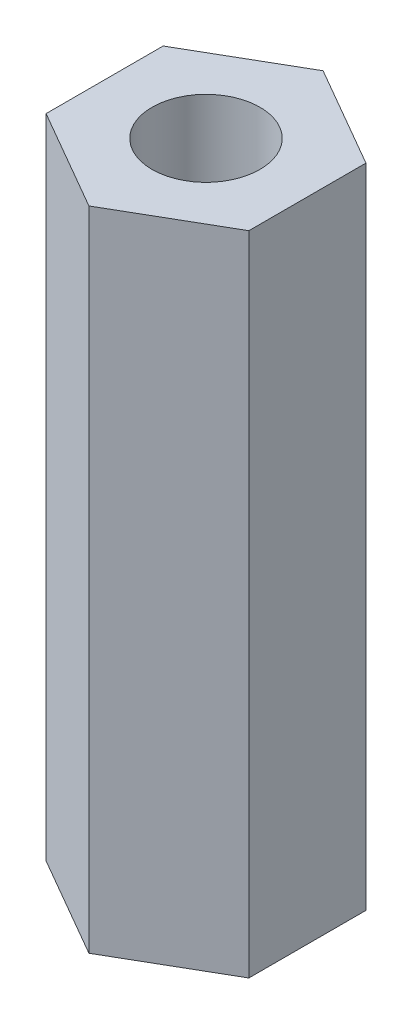
ISO-10303-21;
HEADER;
FILE_DESCRIPTION(('STEP AP214'),'2;1');
FILE_NAME('part.step','',(''),(''),'','','');
FILE_SCHEMA(('AUTOMOTIVE_DESIGN { 1 0 10303 214 1 1 1 1 }'));
ENDSEC;
DATA;
#1=APPLICATION_CONTEXT('core data for automotive mechanical design processes');
#2=APPLICATION_PROTOCOL_DEFINITION('international standard','automotive_design',2000,#1);
#3=PRODUCT_CONTEXT('',#1,'mechanical');
#4=PRODUCT('Part','Part','',(#3));
#5=PRODUCT_RELATED_PRODUCT_CATEGORY('part','',(#4));
#6=PRODUCT_DEFINITION_FORMATION('','',#4);
#7=PRODUCT_DEFINITION_CONTEXT('part definition',#1,'design');
#8=PRODUCT_DEFINITION('design','',#6,#7);
#9=PRODUCT_DEFINITION_SHAPE('','',#8);
#10=(LENGTH_UNIT() NAMED_UNIT(*) SI_UNIT(.MILLI.,.METRE.));
#11=(NAMED_UNIT(*) PLANE_ANGLE_UNIT() SI_UNIT($,.RADIAN.));
#12=(NAMED_UNIT(*) SI_UNIT($,.STERADIAN.) SOLID_ANGLE_UNIT());
#13=UNCERTAINTY_MEASURE_WITH_UNIT(LENGTH_MEASURE(1.E-05),#10,'distance_accuracy_value','');
#14=(GEOMETRIC_REPRESENTATION_CONTEXT(3) GLOBAL_UNCERTAINTY_ASSIGNED_CONTEXT((#13)) GLOBAL_UNIT_ASSIGNED_CONTEXT((#10,
#11,#12)) REPRESENTATION_CONTEXT('',''));
#15=CARTESIAN_POINT('',(0.,0.,0.));
#16=DIRECTION('',(0.,0.,1.));
#17=DIRECTION('',(1.,0.,0.));
#18=AXIS2_PLACEMENT_3D('',#15,#16,#17);
#19=CARTESIAN_POINT('',(0.,0.,0.));
#20=DIRECTION('',(0.,1.,0.));
#21=DIRECTION('',(0.,0.,1.));
#22=AXIS2_PLACEMENT_3D('',#19,#20,#21);
#23=CYLINDRICAL_SURFACE('',#22,1.25);
#24=CARTESIAN_POINT('',(0.,21.,0.));
#25=DIRECTION('',(0.,1.,0.));
#26=DIRECTION('',(0.,0.,1.));
#27=AXIS2_PLACEMENT_3D('',#24,#25,#26);
#28=CIRCLE('',#27,1.25);
#29=CARTESIAN_POINT('',(0.,21.,1.25));
#30=VERTEX_POINT('',#29);
#31=EDGE_CURVE('E131',#30,#30,#28,.T.);
#32=ORIENTED_EDGE('',*,*,#31,.T.);
#33=EDGE_LOOP('',(#32));
#34=FACE_BOUND('',#33,.T.);
#35=CARTESIAN_POINT('',(0.,6.,0.));
#36=DIRECTION('',(0.,-1.,0.));
#37=DIRECTION('',(0.,0.,-1.));
#38=AXIS2_PLACEMENT_3D('',#35,#36,#37);
#39=CIRCLE('',#38,1.25);
#40=CARTESIAN_POINT('',(0.,6.,-1.25));
#41=VERTEX_POINT('',#40);
#42=EDGE_CURVE('E45',#41,#41,#39,.F.);
#43=ORIENTED_EDGE('',*,*,#42,.F.);
#44=EDGE_LOOP('',(#43));
#45=FACE_BOUND('',#44,.T.);
#46=ADVANCED_FACE('F41',(#34,#45),#23,.F.);
#47=CARTESIAN_POINT('',(0.,21.,-2.71354626519124));
#48=DIRECTION('',(0.5,0.,0.866025403784438));
#49=DIRECTION('',(0.866025403784438,0.,-0.5));
#50=AXIS2_PLACEMENT_3D('',#47,#48,#49);
#51=PLANE('',#50);
#52=DIRECTION('',(-0.866025403784438,0.,0.5));
#53=VECTOR('',#52,1.);
#54=CARTESIAN_POINT('',(0.,6.,-2.71354626519124));
#55=LINE('',#54,#53);
#56=CARTESIAN_POINT('',(0.,6.,-2.71354626519124));
#57=VERTEX_POINT('',#56);
#58=CARTESIAN_POINT('',(-2.35,6.,-1.35677313259562));
#59=VERTEX_POINT('',#58);
#60=EDGE_CURVE('E127',#57,#59,#55,.T.);
#61=ORIENTED_EDGE('',*,*,#60,.T.);
#62=DIRECTION('',(0.,-1.,0.));
#63=VECTOR('',#62,1.);
#64=CARTESIAN_POINT('',(-2.35,21.,-1.35677313259562));
#65=LINE('',#64,#63);
#66=CARTESIAN_POINT('',(-2.35,21.,-1.35677313259562));
#67=VERTEX_POINT('',#66);
#68=EDGE_CURVE('E11',#67,#59,#65,.T.);
#69=ORIENTED_EDGE('',*,*,#68,.F.);
#70=DIRECTION('',(-0.866025403784438,0.,0.5));
#71=VECTOR('',#70,1.);
#72=CARTESIAN_POINT('',(0.,21.,-2.71354626519124));
#73=LINE('',#72,#71);
#74=CARTESIAN_POINT('',(0.,21.,-2.71354626519124));
#75=VERTEX_POINT('',#74);
#76=EDGE_CURVE('E138',#75,#67,#73,.T.);
#77=ORIENTED_EDGE('',*,*,#76,.F.);
#78=DIRECTION('',(0.,-1.,0.));
#79=VECTOR('',#78,1.);
#80=CARTESIAN_POINT('',(0.,21.,-2.71354626519124));
#81=LINE('',#80,#79);
#82=EDGE_CURVE('E123',#75,#57,#81,.T.);
#83=ORIENTED_EDGE('',*,*,#82,.T.);
#84=EDGE_LOOP('',(#61,#69,#77,#83));
#85=FACE_BOUND('',#84,.T.);
#86=ADVANCED_FACE('F43',(#85),#51,.F.);
#87=CARTESIAN_POINT('',(-2.35,21.,-1.35677313259562));
#88=DIRECTION('',(1.,0.,0.));
#89=DIRECTION('',(0.,0.,-1.));
#90=AXIS2_PLACEMENT_3D('',#87,#88,#89);
#91=PLANE('',#90);
#92=DIRECTION('',(0.,0.,1.));
#93=VECTOR('',#92,1.);
#94=CARTESIAN_POINT('',(-2.35,6.,-1.35677313259562));
#95=LINE('',#94,#93);
#96=CARTESIAN_POINT('',(-2.35,6.,1.35677313259562));
#97=VERTEX_POINT('',#96);
#98=EDGE_CURVE('E130',#59,#97,#95,.T.);
#99=ORIENTED_EDGE('',*,*,#98,.T.);
#100=DIRECTION('',(0.,-1.,0.));
#101=VECTOR('',#100,1.);
#102=CARTESIAN_POINT('',(-2.35,21.,1.35677313259562));
#103=LINE('',#102,#101);
#104=CARTESIAN_POINT('',(-2.35,21.,1.35677313259562));
#105=VERTEX_POINT('',#104);
#106=EDGE_CURVE('E51',#105,#97,#103,.T.);
#107=ORIENTED_EDGE('',*,*,#106,.F.);
#108=DIRECTION('',(0.,0.,1.));
#109=VECTOR('',#108,1.);
#110=CARTESIAN_POINT('',(-2.35,21.,-1.35677313259562));
#111=LINE('',#110,#109);
#112=EDGE_CURVE('E96',#67,#105,#111,.T.);
#113=ORIENTED_EDGE('',*,*,#112,.F.);
#114=ORIENTED_EDGE('',*,*,#68,.T.);
#115=EDGE_LOOP('',(#99,#107,#113,#114));
#116=FACE_BOUND('',#115,.T.);
#117=ADVANCED_FACE('F170',(#116),#91,.F.);
#118=CARTESIAN_POINT('',(-2.35,21.,1.35677313259562));
#119=DIRECTION('',(0.5,0.,-0.866025403784439));
#120=DIRECTION('',(-0.866025403784439,0.,-0.5));
#121=AXIS2_PLACEMENT_3D('',#118,#119,#120);
#122=PLANE('',#121);
#123=DIRECTION('',(0.866025403784439,0.,0.5));
#124=VECTOR('',#123,1.);
#125=CARTESIAN_POINT('',(-2.35,6.,1.35677313259562));
#126=LINE('',#125,#124);
#127=CARTESIAN_POINT('',(0.,6.,2.71354626519124));
#128=VERTEX_POINT('',#127);
#129=EDGE_CURVE('E133',#97,#128,#126,.T.);
#130=ORIENTED_EDGE('',*,*,#129,.T.);
#131=DIRECTION('',(0.,-1.,0.));
#132=VECTOR('',#131,1.);
#133=CARTESIAN_POINT('',(0.,21.,2.71354626519124));
#134=LINE('',#133,#132);
#135=CARTESIAN_POINT('',(0.,21.,2.71354626519124));
#136=VERTEX_POINT('',#135);
#137=EDGE_CURVE('E118',#136,#128,#134,.T.);
#138=ORIENTED_EDGE('',*,*,#137,.F.);
#139=DIRECTION('',(0.866025403784439,0.,0.5));
#140=VECTOR('',#139,1.);
#141=CARTESIAN_POINT('',(-2.35,21.,1.35677313259562));
#142=LINE('',#141,#140);
#143=EDGE_CURVE('E109',#105,#136,#142,.T.);
#144=ORIENTED_EDGE('',*,*,#143,.F.);
#145=ORIENTED_EDGE('',*,*,#106,.T.);
#146=EDGE_LOOP('',(#130,#138,#144,#145));
#147=FACE_BOUND('',#146,.T.);
#148=ADVANCED_FACE('F145',(#147),#122,.F.);
#149=CARTESIAN_POINT('',(0.,21.,2.71354626519124));
#150=DIRECTION('',(-0.5,0.,-0.866025403784439));
#151=DIRECTION('',(-0.866025403784439,0.,0.5));
#152=AXIS2_PLACEMENT_3D('',#149,#150,#151);
#153=PLANE('',#152);
#154=DIRECTION('',(0.866025403784439,0.,-0.5));
#155=VECTOR('',#154,1.);
#156=CARTESIAN_POINT('',(0.,6.,2.71354626519124));
#157=LINE('',#156,#155);
#158=CARTESIAN_POINT('',(2.35,6.,1.35677313259562));
#159=VERTEX_POINT('',#158);
#160=EDGE_CURVE('E117',#128,#159,#157,.T.);
#161=ORIENTED_EDGE('',*,*,#160,.T.);
#162=DIRECTION('',(0.,-1.,0.));
#163=VECTOR('',#162,1.);
#164=CARTESIAN_POINT('',(2.35,21.,1.35677313259562));
#165=LINE('',#164,#163);
#166=CARTESIAN_POINT('',(2.35,21.,1.35677313259562));
#167=VERTEX_POINT('',#166);
#168=EDGE_CURVE('E114',#167,#159,#165,.T.);
#169=ORIENTED_EDGE('',*,*,#168,.F.);
#170=DIRECTION('',(0.866025403784439,0.,-0.5));
#171=VECTOR('',#170,1.);
#172=CARTESIAN_POINT('',(0.,21.,2.71354626519124));
#173=LINE('',#172,#171);
#174=EDGE_CURVE('E103',#136,#167,#173,.T.);
#175=ORIENTED_EDGE('',*,*,#174,.F.);
#176=ORIENTED_EDGE('',*,*,#137,.T.);
#177=EDGE_LOOP('',(#161,#169,#175,#176));
#178=FACE_BOUND('',#177,.T.);
#179=ADVANCED_FACE('F115',(#178),#153,.F.);
#180=CARTESIAN_POINT('',(2.35,21.,1.35677313259562));
#181=DIRECTION('',(-1.,0.,0.));
#182=DIRECTION('',(0.,0.,1.));
#183=AXIS2_PLACEMENT_3D('',#180,#181,#182);
#184=PLANE('',#183);
#185=DIRECTION('',(0.,0.,-1.));
#186=VECTOR('',#185,1.);
#187=CARTESIAN_POINT('',(2.35,6.,1.35677313259562));
#188=LINE('',#187,#186);
#189=CARTESIAN_POINT('',(2.35,6.,-1.35677313259562));
#190=VERTEX_POINT('',#189);
#191=EDGE_CURVE('E82',#159,#190,#188,.T.);
#192=ORIENTED_EDGE('',*,*,#191,.T.);
#193=DIRECTION('',(0.,-1.,0.));
#194=VECTOR('',#193,1.);
#195=CARTESIAN_POINT('',(2.35,21.,-1.35677313259562));
#196=LINE('',#195,#194);
#197=CARTESIAN_POINT('',(2.35,21.,-1.35677313259562));
#198=VERTEX_POINT('',#197);
#199=EDGE_CURVE('E119',#198,#190,#196,.T.);
#200=ORIENTED_EDGE('',*,*,#199,.F.);
#201=DIRECTION('',(0.,0.,-1.));
#202=VECTOR('',#201,1.);
#203=CARTESIAN_POINT('',(2.35,21.,1.35677313259562));
#204=LINE('',#203,#202);
#205=EDGE_CURVE('E107',#167,#198,#204,.T.);
#206=ORIENTED_EDGE('',*,*,#205,.F.);
#207=ORIENTED_EDGE('',*,*,#168,.T.);
#208=EDGE_LOOP('',(#192,#200,#206,#207));
#209=FACE_BOUND('',#208,.T.);
#210=ADVANCED_FACE('F121',(#209),#184,.F.);
#211=CARTESIAN_POINT('',(2.35,21.,-1.35677313259562));
#212=DIRECTION('',(-0.5,0.,0.866025403784438));
#213=DIRECTION('',(0.866025403784439,0.,0.5));
#214=AXIS2_PLACEMENT_3D('',#211,#212,#213);
#215=PLANE('',#214);
#216=DIRECTION('',(-0.866025403784439,0.,-0.5));
#217=VECTOR('',#216,1.);
#218=CARTESIAN_POINT('',(2.35,6.,-1.35677313259562));
#219=LINE('',#218,#217);
#220=EDGE_CURVE('E88',#190,#57,#219,.T.);
#221=ORIENTED_EDGE('',*,*,#220,.T.);
#222=ORIENTED_EDGE('',*,*,#82,.F.);
#223=DIRECTION('',(-0.866025403784439,0.,-0.5));
#224=VECTOR('',#223,1.);
#225=CARTESIAN_POINT('',(2.35,21.,-1.35677313259562));
#226=LINE('',#225,#224);
#227=EDGE_CURVE('E59',#198,#75,#226,.T.);
#228=ORIENTED_EDGE('',*,*,#227,.F.);
#229=ORIENTED_EDGE('',*,*,#199,.T.);
#230=EDGE_LOOP('',(#221,#222,#228,#229));
#231=FACE_BOUND('',#230,.T.);
#232=ADVANCED_FACE('F153',(#231),#215,.F.);
#233=CARTESIAN_POINT('',(0.,21.,0.));
#234=DIRECTION('',(0.,1.,0.));
#235=DIRECTION('',(0.,0.,1.));
#236=AXIS2_PLACEMENT_3D('',#233,#234,#235);
#237=PLANE('',#236);
#238=ORIENTED_EDGE('',*,*,#31,.F.);
#239=EDGE_LOOP('',(#238));
#240=FACE_BOUND('',#239,.T.);
#241=ORIENTED_EDGE('',*,*,#76,.T.);
#242=ORIENTED_EDGE('',*,*,#112,.T.);
#243=ORIENTED_EDGE('',*,*,#143,.T.);
#244=ORIENTED_EDGE('',*,*,#174,.T.);
#245=ORIENTED_EDGE('',*,*,#205,.T.);
#246=ORIENTED_EDGE('',*,*,#227,.T.);
#247=EDGE_LOOP('',(#241,#242,#243,#244,#245,#246));
#248=FACE_BOUND('',#247,.T.);
#249=ADVANCED_FACE('F105',(#240,#248),#237,.T.);
#250=CARTESIAN_POINT('',(0.,6.,0.));
#251=DIRECTION('',(0.,1.,0.));
#252=DIRECTION('',(0.,0.,1.));
#253=AXIS2_PLACEMENT_3D('',#250,#251,#252);
#254=PLANE('',#253);
#255=ORIENTED_EDGE('',*,*,#60,.F.);
#256=ORIENTED_EDGE('',*,*,#220,.F.);
#257=ORIENTED_EDGE('',*,*,#191,.F.);
#258=ORIENTED_EDGE('',*,*,#160,.F.);
#259=ORIENTED_EDGE('',*,*,#129,.F.);
#260=ORIENTED_EDGE('',*,*,#98,.F.);
#261=EDGE_LOOP('',(#255,#256,#257,#258,#259,#260));
#262=FACE_BOUND('',#261,.T.);
#263=ORIENTED_EDGE('',*,*,#42,.T.);
#264=EDGE_LOOP('',(#263));
#265=FACE_BOUND('',#264,.T.);
#266=ADVANCED_FACE('F148',(#262,#265),#254,.F.);
#267=CLOSED_SHELL('',(#46,#86,#117,#148,#179,#210,#232,#249,#266));
#268=MANIFOLD_SOLID_BREP('B2',#267);
#269=ADVANCED_BREP_SHAPE_REPRESENTATION('',(#18,#268),#14);
#270=SHAPE_DEFINITION_REPRESENTATION(#9,#269);
ENDSEC;
END-ISO-10303-21;
